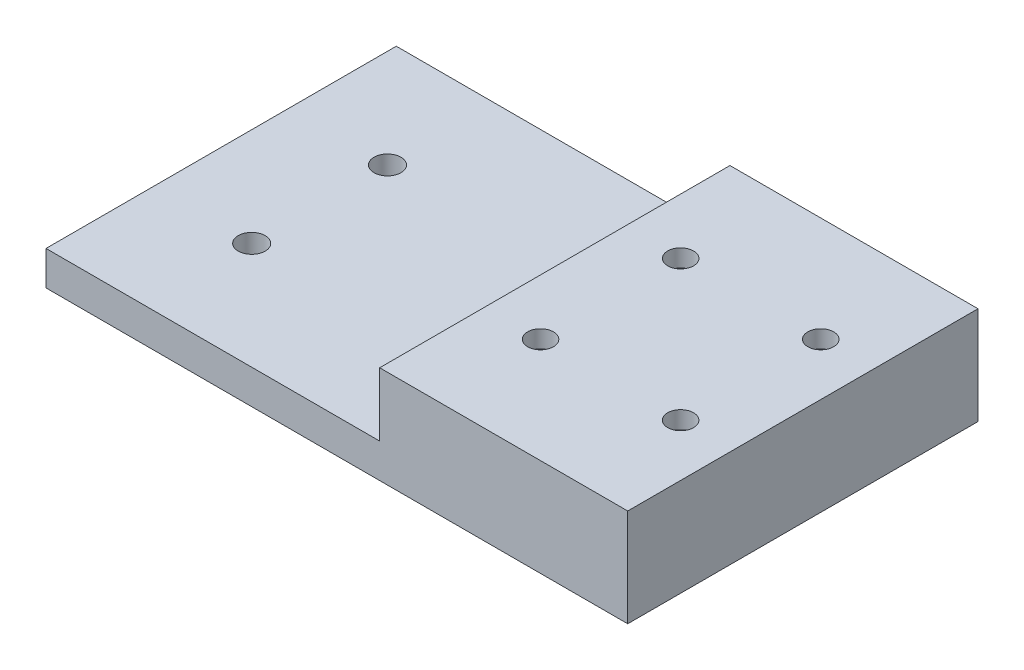
ISO-10303-21;
HEADER;
FILE_DESCRIPTION(('STEP AP214'),'2;1');
FILE_NAME('part.step','',(''),(''),'','','');
FILE_SCHEMA(('AUTOMOTIVE_DESIGN { 1 0 10303 214 1 1 1 1 }'));
ENDSEC;
DATA;
#1=APPLICATION_CONTEXT('core data for automotive mechanical design processes');
#2=APPLICATION_PROTOCOL_DEFINITION('international standard','automotive_design',2000,#1);
#3=PRODUCT_CONTEXT('',#1,'mechanical');
#4=PRODUCT('Part','Part','',(#3));
#5=PRODUCT_RELATED_PRODUCT_CATEGORY('part','',(#4));
#6=PRODUCT_DEFINITION_FORMATION('','',#4);
#7=PRODUCT_DEFINITION_CONTEXT('part definition',#1,'design');
#8=PRODUCT_DEFINITION('design','',#6,#7);
#9=PRODUCT_DEFINITION_SHAPE('','',#8);
#10=(LENGTH_UNIT() NAMED_UNIT(*) SI_UNIT(.MILLI.,.METRE.));
#11=(NAMED_UNIT(*) PLANE_ANGLE_UNIT() SI_UNIT($,.RADIAN.));
#12=(NAMED_UNIT(*) SI_UNIT($,.STERADIAN.) SOLID_ANGLE_UNIT());
#13=UNCERTAINTY_MEASURE_WITH_UNIT(LENGTH_MEASURE(1.E-05),#10,'distance_accuracy_value','');
#14=(GEOMETRIC_REPRESENTATION_CONTEXT(3) GLOBAL_UNCERTAINTY_ASSIGNED_CONTEXT((#13)) GLOBAL_UNIT_ASSIGNED_CONTEXT((#10,
#11,#12)) REPRESENTATION_CONTEXT('',''));
#15=CARTESIAN_POINT('',(0.,0.,0.));
#16=DIRECTION('',(0.,0.,1.));
#17=DIRECTION('',(1.,0.,0.));
#18=AXIS2_PLACEMENT_3D('',#15,#16,#17);
#19=CARTESIAN_POINT('',(-63.5,6.35,-32.5));
#20=DIRECTION('',(1.,0.,0.));
#21=DIRECTION('',(0.,0.,-1.));
#22=AXIS2_PLACEMENT_3D('',#19,#20,#21);
#23=PLANE('',#22);
#24=DIRECTION('',(0.,0.,1.));
#25=VECTOR('',#24,1.);
#26=CARTESIAN_POINT('',(-63.5,0.,-32.5));
#27=LINE('',#26,#25);
#28=CARTESIAN_POINT('',(-63.5,0.,-32.5));
#29=VERTEX_POINT('',#28);
#30=CARTESIAN_POINT('',(-63.5,0.,32.5));
#31=VERTEX_POINT('',#30);
#32=EDGE_CURVE('E116',#29,#31,#27,.T.);
#33=ORIENTED_EDGE('',*,*,#32,.T.);
#34=DIRECTION('',(0.,-1.,0.));
#35=VECTOR('',#34,1.);
#36=CARTESIAN_POINT('',(-63.5,6.35,32.5));
#37=LINE('',#36,#35);
#38=CARTESIAN_POINT('',(-63.5,6.35,32.5));
#39=VERTEX_POINT('',#38);
#40=EDGE_CURVE('E52',#39,#31,#37,.T.);
#41=ORIENTED_EDGE('',*,*,#40,.F.);
#42=DIRECTION('',(0.,0.,1.));
#43=VECTOR('',#42,1.);
#44=CARTESIAN_POINT('',(-63.5,6.35,-32.5));
#45=LINE('',#44,#43);
#46=CARTESIAN_POINT('',(-63.5,6.35,-32.5));
#47=VERTEX_POINT('',#46);
#48=EDGE_CURVE('E118',#47,#39,#45,.T.);
#49=ORIENTED_EDGE('',*,*,#48,.F.);
#50=DIRECTION('',(0.,-1.,0.));
#51=VECTOR('',#50,1.);
#52=CARTESIAN_POINT('',(-63.5,6.35,-32.5));
#53=LINE('',#52,#51);
#54=EDGE_CURVE('E124',#47,#29,#53,.T.);
#55=ORIENTED_EDGE('',*,*,#54,.T.);
#56=EDGE_LOOP('',(#33,#41,#49,#55));
#57=FACE_BOUND('',#56,.T.);
#58=ADVANCED_FACE('F44',(#57),#23,.F.);
#59=CARTESIAN_POINT('',(-63.5,6.35,32.5));
#60=DIRECTION('',(0.,0.,-1.));
#61=DIRECTION('',(-1.,0.,0.));
#62=AXIS2_PLACEMENT_3D('',#59,#60,#61);
#63=PLANE('',#62);
#64=DIRECTION('',(1.,0.,0.));
#65=VECTOR('',#64,1.);
#66=CARTESIAN_POINT('',(-63.5,0.,32.5));
#67=LINE('',#66,#65);
#68=CARTESIAN_POINT('',(44.45,0.,32.5));
#69=VERTEX_POINT('',#68);
#70=EDGE_CURVE('E108',#31,#69,#67,.T.);
#71=ORIENTED_EDGE('',*,*,#70,.T.);
#72=DIRECTION('',(0.,-1.,0.));
#73=VECTOR('',#72,1.);
#74=CARTESIAN_POINT('',(44.45,18.13245,32.5));
#75=LINE('',#74,#73);
#76=CARTESIAN_POINT('',(44.45,18.132425,32.5));
#77=VERTEX_POINT('',#76);
#78=EDGE_CURVE('E95',#77,#69,#75,.T.);
#79=ORIENTED_EDGE('',*,*,#78,.F.);
#80=DIRECTION('',(1.,0.,0.));
#81=VECTOR('',#80,1.);
#82=CARTESIAN_POINT('',(63.5,18.132425,32.5));
#83=LINE('',#82,#81);
#84=CARTESIAN_POINT('',(-1.57999999999998,18.132425,32.5));
#85=VERTEX_POINT('',#84);
#86=EDGE_CURVE('E140',#85,#77,#83,.T.);
#87=ORIENTED_EDGE('',*,*,#86,.F.);
#88=DIRECTION('',(0.,-1.,0.));
#89=VECTOR('',#88,1.);
#90=CARTESIAN_POINT('',(-1.57999999999998,18.132425,32.5));
#91=LINE('',#90,#89);
#92=CARTESIAN_POINT('',(-1.57999999999998,6.35,32.5));
#93=VERTEX_POINT('',#92);
#94=EDGE_CURVE('E144',#85,#93,#91,.T.);
#95=ORIENTED_EDGE('',*,*,#94,.T.);
#96=DIRECTION('',(1.,0.,0.));
#97=VECTOR('',#96,1.);
#98=CARTESIAN_POINT('',(-63.5,6.35,32.5));
#99=LINE('',#98,#97);
#100=EDGE_CURVE('E129',#39,#93,#99,.T.);
#101=ORIENTED_EDGE('',*,*,#100,.F.);
#102=ORIENTED_EDGE('',*,*,#40,.T.);
#103=EDGE_LOOP('',(#71,#79,#87,#95,#101,#102));
#104=FACE_BOUND('',#103,.T.);
#105=ADVANCED_FACE('F113',(#104),#63,.F.);
#106=CARTESIAN_POINT('',(-63.5,6.35,-32.5));
#107=DIRECTION('',(0.,0.,1.));
#108=DIRECTION('',(1.,0.,0.));
#109=AXIS2_PLACEMENT_3D('',#106,#107,#108);
#110=PLANE('',#109);
#111=DIRECTION('',(-1.,0.,0.));
#112=VECTOR('',#111,1.);
#113=CARTESIAN_POINT('',(63.5,18.132425,-32.5));
#114=LINE('',#113,#112);
#115=CARTESIAN_POINT('',(44.45,18.132425,-32.5));
#116=VERTEX_POINT('',#115);
#117=CARTESIAN_POINT('',(-1.57999999999998,18.132425,-32.5));
#118=VERTEX_POINT('',#117);
#119=EDGE_CURVE('E143',#116,#118,#114,.T.);
#120=ORIENTED_EDGE('',*,*,#119,.F.);
#121=DIRECTION('',(0.,-1.,0.));
#122=VECTOR('',#121,1.);
#123=CARTESIAN_POINT('',(44.45,18.13245,-32.5));
#124=LINE('',#123,#122);
#125=CARTESIAN_POINT('',(44.45,0.,-32.5));
#126=VERTEX_POINT('',#125);
#127=EDGE_CURVE('E59',#116,#126,#124,.T.);
#128=ORIENTED_EDGE('',*,*,#127,.T.);
#129=DIRECTION('',(-1.,0.,0.));
#130=VECTOR('',#129,1.);
#131=CARTESIAN_POINT('',(-63.5,0.,-32.5));
#132=LINE('',#131,#130);
#133=EDGE_CURVE('E110',#126,#29,#132,.T.);
#134=ORIENTED_EDGE('',*,*,#133,.T.);
#135=ORIENTED_EDGE('',*,*,#54,.F.);
#136=DIRECTION('',(-1.,0.,0.));
#137=VECTOR('',#136,1.);
#138=CARTESIAN_POINT('',(-63.5,6.35,-32.5));
#139=LINE('',#138,#137);
#140=CARTESIAN_POINT('',(-1.57999999999998,6.35,-32.5));
#141=VERTEX_POINT('',#140);
#142=EDGE_CURVE('E127',#141,#47,#139,.T.);
#143=ORIENTED_EDGE('',*,*,#142,.F.);
#144=DIRECTION('',(0.,-1.,0.));
#145=VECTOR('',#144,1.);
#146=CARTESIAN_POINT('',(-1.57999999999998,18.132425,-32.5));
#147=LINE('',#146,#145);
#148=EDGE_CURVE('E120',#118,#141,#147,.T.);
#149=ORIENTED_EDGE('',*,*,#148,.F.);
#150=EDGE_LOOP('',(#120,#128,#134,#135,#143,#149));
#151=FACE_BOUND('',#150,.T.);
#152=ADVANCED_FACE('F213',(#151),#110,.F.);
#153=CARTESIAN_POINT('',(-63.5,6.35,32.5));
#154=DIRECTION('',(0.,1.,0.));
#155=DIRECTION('',(0.,0.,1.));
#156=AXIS2_PLACEMENT_3D('',#153,#154,#155);
#157=PLANE('',#156);
#158=CARTESIAN_POINT('',(-45.2299999304052,6.35,12.6000000000036));
#159=DIRECTION('',(0.,1.,0.));
#160=DIRECTION('',(0.,0.,1.));
#161=AXIS2_PLACEMENT_3D('',#158,#159,#160);
#162=CIRCLE('',#161,2.5);
#163=CARTESIAN_POINT('',(-45.2299999304052,6.35,15.1000000000036));
#164=VERTEX_POINT('',#163);
#165=EDGE_CURVE('E47',#164,#164,#162,.T.);
#166=ORIENTED_EDGE('',*,*,#165,.F.);
#167=EDGE_LOOP('',(#166));
#168=FACE_BOUND('',#167,.T.);
#169=CARTESIAN_POINT('',(-45.2299999304053,6.35,-12.5999999999964));
#170=DIRECTION('',(0.,1.,0.));
#171=DIRECTION('',(0.,0.,1.));
#172=AXIS2_PLACEMENT_3D('',#169,#170,#171);
#173=CIRCLE('',#172,2.5);
#174=CARTESIAN_POINT('',(-45.2299999304053,6.35,-10.0999999999964));
#175=VERTEX_POINT('',#174);
#176=EDGE_CURVE('E307',#175,#175,#173,.T.);
#177=ORIENTED_EDGE('',*,*,#176,.F.);
#178=EDGE_LOOP('',(#177));
#179=FACE_BOUND('',#178,.T.);
#180=DIRECTION('',(0.,0.,1.));
#181=VECTOR('',#180,1.);
#182=CARTESIAN_POINT('',(-1.57999999999998,6.35,32.5));
#183=LINE('',#182,#181);
#184=EDGE_CURVE('E67',#141,#93,#183,.T.);
#185=ORIENTED_EDGE('',*,*,#184,.F.);
#186=ORIENTED_EDGE('',*,*,#142,.T.);
#187=ORIENTED_EDGE('',*,*,#48,.T.);
#188=ORIENTED_EDGE('',*,*,#100,.T.);
#189=EDGE_LOOP('',(#185,#186,#187,#188));
#190=FACE_BOUND('',#189,.T.);
#191=ADVANCED_FACE('F216',(#168,#179,#190),#157,.T.);
#192=CARTESIAN_POINT('',(-63.5,0.,32.5));
#193=DIRECTION('',(0.,1.,0.));
#194=DIRECTION('',(0.,0.,1.));
#195=AXIS2_PLACEMENT_3D('',#192,#193,#194);
#196=PLANE('',#195);
#197=CARTESIAN_POINT('',(-45.2299999304052,0.,12.6000000000036));
#198=DIRECTION('',(0.,-1.,0.));
#199=DIRECTION('',(0.,0.,-1.));
#200=AXIS2_PLACEMENT_3D('',#197,#198,#199);
#201=CIRCLE('',#200,2.5);
#202=CARTESIAN_POINT('',(-45.2299999304052,0.,10.1000000000036));
#203=VERTEX_POINT('',#202);
#204=EDGE_CURVE('E301',#203,#203,#201,.T.);
#205=ORIENTED_EDGE('',*,*,#204,.F.);
#206=EDGE_LOOP('',(#205));
#207=FACE_BOUND('',#206,.T.);
#208=CARTESIAN_POINT('',(-45.2299999304053,0.,-12.5999999999964));
#209=DIRECTION('',(0.,-1.,0.));
#210=DIRECTION('',(0.,0.,-1.));
#211=AXIS2_PLACEMENT_3D('',#208,#209,#210);
#212=CIRCLE('',#211,2.5);
#213=CARTESIAN_POINT('',(-45.2299999304053,0.,-15.0999999999964));
#214=VERTEX_POINT('',#213);
#215=EDGE_CURVE('E303',#214,#214,#212,.T.);
#216=ORIENTED_EDGE('',*,*,#215,.F.);
#217=EDGE_LOOP('',(#216));
#218=FACE_BOUND('',#217,.T.);
#219=CARTESIAN_POINT('',(8.77000000000005,0.,13.));
#220=DIRECTION('',(0.,-1.,0.));
#221=DIRECTION('',(0.,0.,-1.));
#222=AXIS2_PLACEMENT_3D('',#219,#220,#221);
#223=CIRCLE('',#222,4.3);
#224=CARTESIAN_POINT('',(8.77000000000005,0.,8.69999999999996));
#225=VERTEX_POINT('',#224);
#226=EDGE_CURVE('E180',#225,#225,#223,.T.);
#227=ORIENTED_EDGE('',*,*,#226,.F.);
#228=EDGE_LOOP('',(#227));
#229=FACE_BOUND('',#228,.T.);
#230=CARTESIAN_POINT('',(34.7700000000003,0.,13.0000000000001));
#231=DIRECTION('',(0.,-1.,0.));
#232=DIRECTION('',(0.,0.,-1.));
#233=AXIS2_PLACEMENT_3D('',#230,#231,#232);
#234=CIRCLE('',#233,4.3);
#235=CARTESIAN_POINT('',(34.7700000000003,0.,8.70000000000007));
#236=VERTEX_POINT('',#235);
#237=EDGE_CURVE('E167',#236,#236,#234,.T.);
#238=ORIENTED_EDGE('',*,*,#237,.F.);
#239=EDGE_LOOP('',(#238));
#240=FACE_BOUND('',#239,.T.);
#241=CARTESIAN_POINT('',(34.7700000000003,0.,-13.));
#242=DIRECTION('',(0.,-1.,0.));
#243=DIRECTION('',(0.,0.,-1.));
#244=AXIS2_PLACEMENT_3D('',#241,#242,#243);
#245=CIRCLE('',#244,4.3);
#246=CARTESIAN_POINT('',(34.7700000000003,0.,-17.3));
#247=VERTEX_POINT('',#246);
#248=EDGE_CURVE('E163',#247,#247,#245,.T.);
#249=ORIENTED_EDGE('',*,*,#248,.F.);
#250=EDGE_LOOP('',(#249));
#251=FACE_BOUND('',#250,.T.);
#252=CARTESIAN_POINT('',(8.77000000000005,0.,-13.0000000000001));
#253=DIRECTION('',(0.,-1.,0.));
#254=DIRECTION('',(0.,0.,-1.));
#255=AXIS2_PLACEMENT_3D('',#252,#253,#254);
#256=CIRCLE('',#255,4.3);
#257=CARTESIAN_POINT('',(8.77000000000005,0.,-17.3000000000001));
#258=VERTEX_POINT('',#257);
#259=EDGE_CURVE('E159',#258,#258,#256,.T.);
#260=ORIENTED_EDGE('',*,*,#259,.F.);
#261=EDGE_LOOP('',(#260));
#262=FACE_BOUND('',#261,.T.);
#263=ORIENTED_EDGE('',*,*,#133,.F.);
#264=DIRECTION('',(0.,0.,-1.));
#265=VECTOR('',#264,1.);
#266=CARTESIAN_POINT('',(44.45,0.,32.5));
#267=LINE('',#266,#265);
#268=EDGE_CURVE('E98',#69,#126,#267,.T.);
#269=ORIENTED_EDGE('',*,*,#268,.F.);
#270=ORIENTED_EDGE('',*,*,#70,.F.);
#271=ORIENTED_EDGE('',*,*,#32,.F.);
#272=EDGE_LOOP('',(#263,#269,#270,#271));
#273=FACE_BOUND('',#272,.T.);
#274=ADVANCED_FACE('F106',(#207,#218,#229,#240,#251,#262,#273),#196,.F.);
#275=CARTESIAN_POINT('',(-1.57999999999998,18.132425,32.5));
#276=DIRECTION('',(1.,0.,0.));
#277=DIRECTION('',(0.,0.,-1.));
#278=AXIS2_PLACEMENT_3D('',#275,#276,#277);
#279=PLANE('',#278);
#280=ORIENTED_EDGE('',*,*,#184,.T.);
#281=ORIENTED_EDGE('',*,*,#94,.F.);
#282=DIRECTION('',(0.,0.,1.));
#283=VECTOR('',#282,1.);
#284=CARTESIAN_POINT('',(-1.57999999999998,18.132425,32.5));
#285=LINE('',#284,#283);
#286=EDGE_CURVE('E203',#118,#85,#285,.T.);
#287=ORIENTED_EDGE('',*,*,#286,.F.);
#288=ORIENTED_EDGE('',*,*,#148,.T.);
#289=EDGE_LOOP('',(#280,#281,#287,#288));
#290=FACE_BOUND('',#289,.T.);
#291=ADVANCED_FACE('F210',(#290),#279,.F.);
#292=CARTESIAN_POINT('',(63.5,18.132425,-32.5));
#293=DIRECTION('',(0.,1.,0.));
#294=DIRECTION('',(0.,0.,1.));
#295=AXIS2_PLACEMENT_3D('',#292,#293,#294);
#296=PLANE('',#295);
#297=CARTESIAN_POINT('',(8.77000000000005,18.132425,13.));
#298=DIRECTION('',(0.,1.,0.));
#299=DIRECTION('',(0.,0.,1.));
#300=AXIS2_PLACEMENT_3D('',#297,#298,#299);
#301=CIRCLE('',#300,2.4);
#302=CARTESIAN_POINT('',(8.77000000000005,18.132425,15.4));
#303=VERTEX_POINT('',#302);
#304=EDGE_CURVE('E165',#303,#303,#301,.T.);
#305=ORIENTED_EDGE('',*,*,#304,.F.);
#306=EDGE_LOOP('',(#305));
#307=FACE_BOUND('',#306,.T.);
#308=CARTESIAN_POINT('',(34.7700000000003,18.132425,13.0000000000001));
#309=DIRECTION('',(0.,1.,0.));
#310=DIRECTION('',(0.,0.,1.));
#311=AXIS2_PLACEMENT_3D('',#308,#309,#310);
#312=CIRCLE('',#311,2.4);
#313=CARTESIAN_POINT('',(34.7700000000003,18.132425,15.4000000000001));
#314=VERTEX_POINT('',#313);
#315=EDGE_CURVE('E161',#314,#314,#312,.T.);
#316=ORIENTED_EDGE('',*,*,#315,.F.);
#317=EDGE_LOOP('',(#316));
#318=FACE_BOUND('',#317,.T.);
#319=CARTESIAN_POINT('',(34.7700000000003,18.132425,-13.));
#320=DIRECTION('',(0.,1.,0.));
#321=DIRECTION('',(0.,0.,1.));
#322=AXIS2_PLACEMENT_3D('',#319,#320,#321);
#323=CIRCLE('',#322,2.4);
#324=CARTESIAN_POINT('',(34.7700000000003,18.132425,-10.6));
#325=VERTEX_POINT('',#324);
#326=EDGE_CURVE('E156',#325,#325,#323,.T.);
#327=ORIENTED_EDGE('',*,*,#326,.F.);
#328=EDGE_LOOP('',(#327));
#329=FACE_BOUND('',#328,.T.);
#330=CARTESIAN_POINT('',(8.77000000000005,18.132425,-13.0000000000001));
#331=DIRECTION('',(0.,1.,0.));
#332=DIRECTION('',(0.,0.,1.));
#333=AXIS2_PLACEMENT_3D('',#330,#331,#332);
#334=CIRCLE('',#333,2.4);
#335=CARTESIAN_POINT('',(8.77000000000005,18.132425,-10.6000000000001));
#336=VERTEX_POINT('',#335);
#337=EDGE_CURVE('E111',#336,#336,#334,.T.);
#338=ORIENTED_EDGE('',*,*,#337,.F.);
#339=EDGE_LOOP('',(#338));
#340=FACE_BOUND('',#339,.T.);
#341=DIRECTION('',(0.,0.,1.));
#342=VECTOR('',#341,1.);
#343=CARTESIAN_POINT('',(44.45,18.132425,-32.5));
#344=LINE('',#343,#342);
#345=EDGE_CURVE('E13',#116,#77,#344,.T.);
#346=ORIENTED_EDGE('',*,*,#345,.F.);
#347=ORIENTED_EDGE('',*,*,#119,.T.);
#348=ORIENTED_EDGE('',*,*,#286,.T.);
#349=ORIENTED_EDGE('',*,*,#86,.T.);
#350=EDGE_LOOP('',(#346,#347,#348,#349));
#351=FACE_BOUND('',#350,.T.);
#352=ADVANCED_FACE('F207',(#307,#318,#329,#340,#351),#296,.T.);
#353=CARTESIAN_POINT('',(44.45,18.13245,32.5));
#354=DIRECTION('',(-1.,0.,0.));
#355=DIRECTION('',(0.,0.,1.));
#356=AXIS2_PLACEMENT_3D('',#353,#354,#355);
#357=PLANE('',#356);
#358=ORIENTED_EDGE('',*,*,#345,.T.);
#359=ORIENTED_EDGE('',*,*,#78,.T.);
#360=ORIENTED_EDGE('',*,*,#268,.T.);
#361=ORIENTED_EDGE('',*,*,#127,.F.);
#362=EDGE_LOOP('',(#358,#359,#360,#361));
#363=FACE_BOUND('',#362,.T.);
#364=ADVANCED_FACE('F97',(#363),#357,.F.);
#365=CARTESIAN_POINT('',(8.77000000000005,0.,-13.0000000000001));
#366=DIRECTION('',(0.,-1.,0.));
#367=DIRECTION('',(0.,0.,-1.));
#368=AXIS2_PLACEMENT_3D('',#365,#366,#367);
#369=CYLINDRICAL_SURFACE('',#368,2.4);
#370=ORIENTED_EDGE('',*,*,#337,.T.);
#371=EDGE_LOOP('',(#370));
#372=FACE_BOUND('',#371,.T.);
#373=CARTESIAN_POINT('',(8.77000000000005,14.9,-13.0000000000001));
#374=DIRECTION('',(0.,-1.,0.));
#375=DIRECTION('',(0.,0.,-1.));
#376=AXIS2_PLACEMENT_3D('',#373,#374,#375);
#377=CIRCLE('',#376,2.4);
#378=CARTESIAN_POINT('',(8.77000000000005,14.9,-15.4000000000001));
#379=VERTEX_POINT('',#378);
#380=EDGE_CURVE('E155',#379,#379,#377,.T.);
#381=ORIENTED_EDGE('',*,*,#380,.T.);
#382=EDGE_LOOP('',(#381));
#383=FACE_BOUND('',#382,.T.);
#384=ADVANCED_FACE('F240',(#372,#383),#369,.F.);
#385=CARTESIAN_POINT('',(11.17,14.9,-13.0000000000001));
#386=DIRECTION('',(0.,1.,0.));
#387=DIRECTION('',(0.,0.,1.));
#388=AXIS2_PLACEMENT_3D('',#385,#386,#387);
#389=PLANE('',#388);
#390=ORIENTED_EDGE('',*,*,#380,.F.);
#391=EDGE_LOOP('',(#390));
#392=FACE_BOUND('',#391,.T.);
#393=CARTESIAN_POINT('',(8.77000000000005,14.9,-13.0000000000001));
#394=DIRECTION('',(0.,-1.,0.));
#395=DIRECTION('',(0.,0.,-1.));
#396=AXIS2_PLACEMENT_3D('',#393,#394,#395);
#397=CIRCLE('',#396,4.3);
#398=CARTESIAN_POINT('',(8.77000000000005,14.9,-17.3000000000001));
#399=VERTEX_POINT('',#398);
#400=EDGE_CURVE('E197',#399,#399,#397,.T.);
#401=ORIENTED_EDGE('',*,*,#400,.T.);
#402=EDGE_LOOP('',(#401));
#403=FACE_BOUND('',#402,.T.);
#404=ADVANCED_FACE('F243',(#392,#403),#389,.F.);
#405=CARTESIAN_POINT('',(8.77000000000005,0.,-13.0000000000001));
#406=DIRECTION('',(0.,-1.,0.));
#407=DIRECTION('',(0.,0.,-1.));
#408=AXIS2_PLACEMENT_3D('',#405,#406,#407);
#409=CYLINDRICAL_SURFACE('',#408,4.3);
#410=ORIENTED_EDGE('',*,*,#400,.F.);
#411=EDGE_LOOP('',(#410));
#412=FACE_BOUND('',#411,.T.);
#413=ORIENTED_EDGE('',*,*,#259,.T.);
#414=EDGE_LOOP('',(#413));
#415=FACE_BOUND('',#414,.T.);
#416=ADVANCED_FACE('F247',(#412,#415),#409,.F.);
#417=CARTESIAN_POINT('',(34.7700000000003,0.,-13.));
#418=DIRECTION('',(0.,-1.,0.));
#419=DIRECTION('',(0.,0.,-1.));
#420=AXIS2_PLACEMENT_3D('',#417,#418,#419);
#421=CYLINDRICAL_SURFACE('',#420,2.4);
#422=ORIENTED_EDGE('',*,*,#326,.T.);
#423=EDGE_LOOP('',(#422));
#424=FACE_BOUND('',#423,.T.);
#425=CARTESIAN_POINT('',(34.7700000000003,14.9,-13.));
#426=DIRECTION('',(0.,-1.,0.));
#427=DIRECTION('',(0.,0.,-1.));
#428=AXIS2_PLACEMENT_3D('',#425,#426,#427);
#429=CIRCLE('',#428,2.4);
#430=CARTESIAN_POINT('',(34.7700000000003,14.9,-15.4));
#431=VERTEX_POINT('',#430);
#432=EDGE_CURVE('E160',#431,#431,#429,.T.);
#433=ORIENTED_EDGE('',*,*,#432,.T.);
#434=EDGE_LOOP('',(#433));
#435=FACE_BOUND('',#434,.T.);
#436=ADVANCED_FACE('F251',(#424,#435),#421,.F.);
#437=CARTESIAN_POINT('',(37.1700000000003,14.9,-13.));
#438=DIRECTION('',(0.,1.,0.));
#439=DIRECTION('',(0.,0.,1.));
#440=AXIS2_PLACEMENT_3D('',#437,#438,#439);
#441=PLANE('',#440);
#442=ORIENTED_EDGE('',*,*,#432,.F.);
#443=EDGE_LOOP('',(#442));
#444=FACE_BOUND('',#443,.T.);
#445=CARTESIAN_POINT('',(34.7700000000003,14.9,-13.));
#446=DIRECTION('',(0.,-1.,0.));
#447=DIRECTION('',(0.,0.,-1.));
#448=AXIS2_PLACEMENT_3D('',#445,#446,#447);
#449=CIRCLE('',#448,4.3);
#450=CARTESIAN_POINT('',(34.7700000000003,14.9,-17.3));
#451=VERTEX_POINT('',#450);
#452=EDGE_CURVE('E190',#451,#451,#449,.T.);
#453=ORIENTED_EDGE('',*,*,#452,.T.);
#454=EDGE_LOOP('',(#453));
#455=FACE_BOUND('',#454,.T.);
#456=ADVANCED_FACE('F255',(#444,#455),#441,.F.);
#457=CARTESIAN_POINT('',(34.7700000000003,0.,-13.));
#458=DIRECTION('',(0.,-1.,0.));
#459=DIRECTION('',(0.,0.,-1.));
#460=AXIS2_PLACEMENT_3D('',#457,#458,#459);
#461=CYLINDRICAL_SURFACE('',#460,4.3);
#462=ORIENTED_EDGE('',*,*,#452,.F.);
#463=EDGE_LOOP('',(#462));
#464=FACE_BOUND('',#463,.T.);
#465=ORIENTED_EDGE('',*,*,#248,.T.);
#466=EDGE_LOOP('',(#465));
#467=FACE_BOUND('',#466,.T.);
#468=ADVANCED_FACE('F259',(#464,#467),#461,.F.);
#469=CARTESIAN_POINT('',(34.7700000000003,0.,13.0000000000001));
#470=DIRECTION('',(0.,-1.,0.));
#471=DIRECTION('',(0.,0.,-1.));
#472=AXIS2_PLACEMENT_3D('',#469,#470,#471);
#473=CYLINDRICAL_SURFACE('',#472,2.4);
#474=ORIENTED_EDGE('',*,*,#315,.T.);
#475=EDGE_LOOP('',(#474));
#476=FACE_BOUND('',#475,.T.);
#477=CARTESIAN_POINT('',(34.7700000000003,14.9,13.0000000000001));
#478=DIRECTION('',(0.,-1.,0.));
#479=DIRECTION('',(0.,0.,-1.));
#480=AXIS2_PLACEMENT_3D('',#477,#478,#479);
#481=CIRCLE('',#480,2.4);
#482=CARTESIAN_POINT('',(34.7700000000003,14.9,10.6000000000001));
#483=VERTEX_POINT('',#482);
#484=EDGE_CURVE('E164',#483,#483,#481,.T.);
#485=ORIENTED_EDGE('',*,*,#484,.T.);
#486=EDGE_LOOP('',(#485));
#487=FACE_BOUND('',#486,.T.);
#488=ADVANCED_FACE('F263',(#476,#487),#473,.F.);
#489=CARTESIAN_POINT('',(37.1700000000003,14.9,13.0000000000001));
#490=DIRECTION('',(0.,1.,0.));
#491=DIRECTION('',(0.,0.,1.));
#492=AXIS2_PLACEMENT_3D('',#489,#490,#491);
#493=PLANE('',#492);
#494=ORIENTED_EDGE('',*,*,#484,.F.);
#495=EDGE_LOOP('',(#494));
#496=FACE_BOUND('',#495,.T.);
#497=CARTESIAN_POINT('',(34.7700000000003,14.9,13.0000000000001));
#498=DIRECTION('',(0.,-1.,0.));
#499=DIRECTION('',(0.,0.,-1.));
#500=AXIS2_PLACEMENT_3D('',#497,#498,#499);
#501=CIRCLE('',#500,4.3);
#502=CARTESIAN_POINT('',(34.7700000000003,14.9,8.70000000000007));
#503=VERTEX_POINT('',#502);
#504=EDGE_CURVE('E172',#503,#503,#501,.T.);
#505=ORIENTED_EDGE('',*,*,#504,.T.);
#506=EDGE_LOOP('',(#505));
#507=FACE_BOUND('',#506,.T.);
#508=ADVANCED_FACE('F267',(#496,#507),#493,.F.);
#509=CARTESIAN_POINT('',(34.7700000000003,0.,13.0000000000001));
#510=DIRECTION('',(0.,-1.,0.));
#511=DIRECTION('',(0.,0.,-1.));
#512=AXIS2_PLACEMENT_3D('',#509,#510,#511);
#513=CYLINDRICAL_SURFACE('',#512,4.3);
#514=ORIENTED_EDGE('',*,*,#504,.F.);
#515=EDGE_LOOP('',(#514));
#516=FACE_BOUND('',#515,.T.);
#517=ORIENTED_EDGE('',*,*,#237,.T.);
#518=EDGE_LOOP('',(#517));
#519=FACE_BOUND('',#518,.T.);
#520=ADVANCED_FACE('F271',(#516,#519),#513,.F.);
#521=CARTESIAN_POINT('',(8.77000000000005,0.,13.));
#522=DIRECTION('',(0.,-1.,0.));
#523=DIRECTION('',(0.,0.,-1.));
#524=AXIS2_PLACEMENT_3D('',#521,#522,#523);
#525=CYLINDRICAL_SURFACE('',#524,2.4);
#526=ORIENTED_EDGE('',*,*,#304,.T.);
#527=EDGE_LOOP('',(#526));
#528=FACE_BOUND('',#527,.T.);
#529=CARTESIAN_POINT('',(8.77000000000005,14.9,13.));
#530=DIRECTION('',(0.,-1.,0.));
#531=DIRECTION('',(0.,0.,-1.));
#532=AXIS2_PLACEMENT_3D('',#529,#530,#531);
#533=CIRCLE('',#532,2.4);
#534=CARTESIAN_POINT('',(8.77000000000005,14.9,10.6));
#535=VERTEX_POINT('',#534);
#536=EDGE_CURVE('E168',#535,#535,#533,.T.);
#537=ORIENTED_EDGE('',*,*,#536,.T.);
#538=EDGE_LOOP('',(#537));
#539=FACE_BOUND('',#538,.T.);
#540=ADVANCED_FACE('F275',(#528,#539),#525,.F.);
#541=CARTESIAN_POINT('',(11.17,14.9,13.));
#542=DIRECTION('',(0.,1.,0.));
#543=DIRECTION('',(0.,0.,1.));
#544=AXIS2_PLACEMENT_3D('',#541,#542,#543);
#545=PLANE('',#544);
#546=ORIENTED_EDGE('',*,*,#536,.F.);
#547=EDGE_LOOP('',(#546));
#548=FACE_BOUND('',#547,.T.);
#549=CARTESIAN_POINT('',(8.77000000000005,14.9,13.));
#550=DIRECTION('',(0.,-1.,0.));
#551=DIRECTION('',(0.,0.,-1.));
#552=AXIS2_PLACEMENT_3D('',#549,#550,#551);
#553=CIRCLE('',#552,4.3);
#554=CARTESIAN_POINT('',(8.77000000000005,14.9,8.69999999999996));
#555=VERTEX_POINT('',#554);
#556=EDGE_CURVE('E175',#555,#555,#553,.T.);
#557=ORIENTED_EDGE('',*,*,#556,.T.);
#558=EDGE_LOOP('',(#557));
#559=FACE_BOUND('',#558,.T.);
#560=ADVANCED_FACE('F279',(#548,#559),#545,.F.);
#561=CARTESIAN_POINT('',(8.77000000000005,0.,13.));
#562=DIRECTION('',(0.,-1.,0.));
#563=DIRECTION('',(0.,0.,-1.));
#564=AXIS2_PLACEMENT_3D('',#561,#562,#563);
#565=CYLINDRICAL_SURFACE('',#564,4.3);
#566=ORIENTED_EDGE('',*,*,#556,.F.);
#567=EDGE_LOOP('',(#566));
#568=FACE_BOUND('',#567,.T.);
#569=ORIENTED_EDGE('',*,*,#226,.T.);
#570=EDGE_LOOP('',(#569));
#571=FACE_BOUND('',#570,.T.);
#572=ADVANCED_FACE('F282',(#568,#571),#565,.F.);
#573=CARTESIAN_POINT('',(-45.2299999304053,0.,-12.5999999999964));
#574=DIRECTION('',(0.,-1.,0.));
#575=DIRECTION('',(0.,0.,-1.));
#576=AXIS2_PLACEMENT_3D('',#573,#574,#575);
#577=CYLINDRICAL_SURFACE('',#576,2.5);
#578=ORIENTED_EDGE('',*,*,#176,.T.);
#579=EDGE_LOOP('',(#578));
#580=FACE_BOUND('',#579,.T.);
#581=ORIENTED_EDGE('',*,*,#215,.T.);
#582=EDGE_LOOP('',(#581));
#583=FACE_BOUND('',#582,.T.);
#584=ADVANCED_FACE('F286',(#580,#583),#577,.F.);
#585=CARTESIAN_POINT('',(-45.2299999304052,0.,12.6000000000036));
#586=DIRECTION('',(0.,-1.,0.));
#587=DIRECTION('',(0.,0.,-1.));
#588=AXIS2_PLACEMENT_3D('',#585,#586,#587);
#589=CYLINDRICAL_SURFACE('',#588,2.5);
#590=ORIENTED_EDGE('',*,*,#165,.T.);
#591=EDGE_LOOP('',(#590));
#592=FACE_BOUND('',#591,.T.);
#593=ORIENTED_EDGE('',*,*,#204,.T.);
#594=EDGE_LOOP('',(#593));
#595=FACE_BOUND('',#594,.T.);
#596=ADVANCED_FACE('F290',(#592,#595),#589,.F.);
#597=CLOSED_SHELL('',(#58,#105,#152,#191,#274,#291,#352,#364,#384,#404,#416,#436,#456,#468,#488,
#508,#520,#540,#560,#572,#584,#596));
#598=MANIFOLD_SOLID_BREP('B2',#597);
#599=ADVANCED_BREP_SHAPE_REPRESENTATION('',(#18,#598),#14);
#600=SHAPE_DEFINITION_REPRESENTATION(#9,#599);
ENDSEC;
END-ISO-10303-21;
